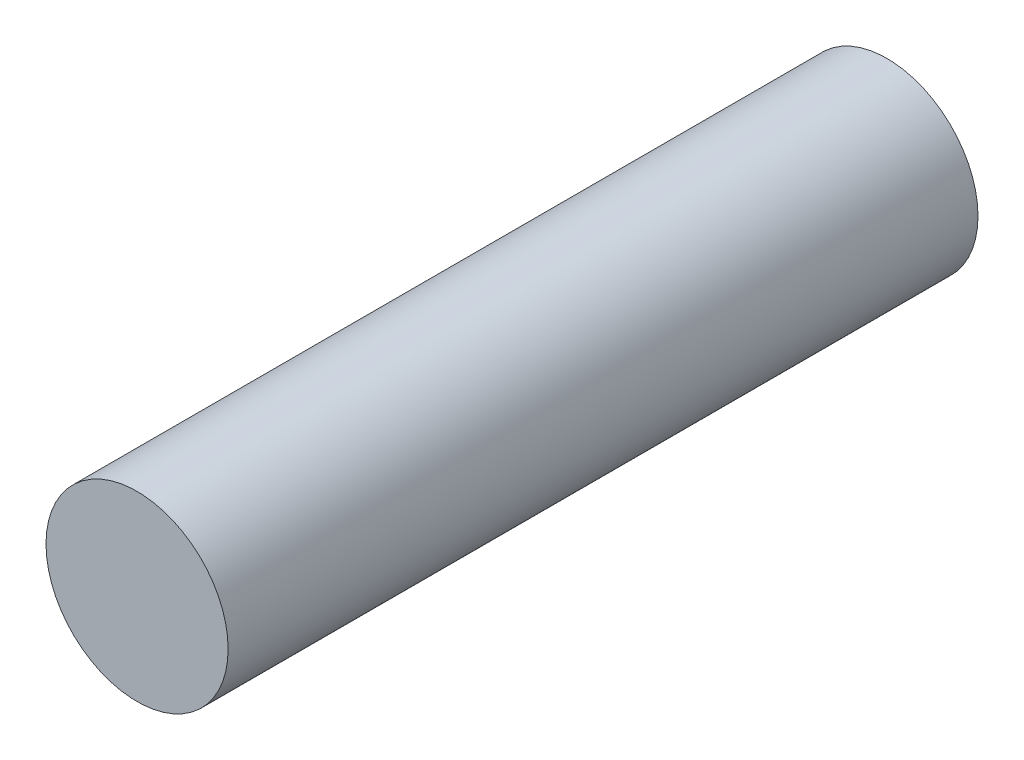
ISO-10303-21;
HEADER;
FILE_DESCRIPTION(('STEP AP214'),'2;1');
FILE_NAME('part.step','',(''),(''),'','','');
FILE_SCHEMA(('AUTOMOTIVE_DESIGN { 1 0 10303 214 1 1 1 1 }'));
ENDSEC;
DATA;
#1=APPLICATION_CONTEXT('core data for automotive mechanical design processes');
#2=APPLICATION_PROTOCOL_DEFINITION('international standard','automotive_design',2000,#1);
#3=PRODUCT_CONTEXT('',#1,'mechanical');
#4=PRODUCT('Part','Part','',(#3));
#5=PRODUCT_RELATED_PRODUCT_CATEGORY('part','',(#4));
#6=PRODUCT_DEFINITION_FORMATION('','',#4);
#7=PRODUCT_DEFINITION_CONTEXT('part definition',#1,'design');
#8=PRODUCT_DEFINITION('design','',#6,#7);
#9=PRODUCT_DEFINITION_SHAPE('','',#8);
#10=(LENGTH_UNIT() NAMED_UNIT(*) SI_UNIT(.MILLI.,.METRE.));
#11=(NAMED_UNIT(*) PLANE_ANGLE_UNIT() SI_UNIT($,.RADIAN.));
#12=(NAMED_UNIT(*) SI_UNIT($,.STERADIAN.) SOLID_ANGLE_UNIT());
#13=UNCERTAINTY_MEASURE_WITH_UNIT(LENGTH_MEASURE(1.E-05),#10,'distance_accuracy_value','');
#14=(GEOMETRIC_REPRESENTATION_CONTEXT(3) GLOBAL_UNCERTAINTY_ASSIGNED_CONTEXT((#13)) GLOBAL_UNIT_ASSIGNED_CONTEXT((#10,
#11,#12)) REPRESENTATION_CONTEXT('',''));
#15=CARTESIAN_POINT('',(0.,0.,0.));
#16=DIRECTION('',(0.,0.,1.));
#17=DIRECTION('',(1.,0.,0.));
#18=AXIS2_PLACEMENT_3D('',#15,#16,#17);
#19=CARTESIAN_POINT('',(0.,0.,35.));
#20=DIRECTION('',(0.,0.,-1.));
#21=DIRECTION('',(-1.,0.,0.));
#22=AXIS2_PLACEMENT_3D('',#19,#20,#21);
#23=CYLINDRICAL_SURFACE('',#22,4.25);
#24=CARTESIAN_POINT('',(0.,0.,35.));
#25=DIRECTION('',(0.,0.,1.));
#26=DIRECTION('',(1.,0.,0.));
#27=AXIS2_PLACEMENT_3D('',#24,#25,#26);
#28=CIRCLE('',#27,4.25);
#29=CARTESIAN_POINT('',(4.25,0.,35.));
#30=VERTEX_POINT('',#29);
#31=EDGE_CURVE('E10',#30,#30,#28,.T.);
#32=ORIENTED_EDGE('',*,*,#31,.F.);
#33=EDGE_LOOP('',(#32));
#34=FACE_BOUND('',#33,.T.);
#35=CARTESIAN_POINT('',(0.,0.,0.));
#36=DIRECTION('',(0.,0.,1.));
#37=DIRECTION('',(1.,0.,0.));
#38=AXIS2_PLACEMENT_3D('',#35,#36,#37);
#39=CIRCLE('',#38,4.25);
#40=CARTESIAN_POINT('',(4.25,0.,0.));
#41=VERTEX_POINT('',#40);
#42=EDGE_CURVE('E45',#41,#41,#39,.T.);
#43=ORIENTED_EDGE('',*,*,#42,.T.);
#44=EDGE_LOOP('',(#43));
#45=FACE_BOUND('',#44,.T.);
#46=ADVANCED_FACE('F42',(#34,#45),#23,.T.);
#47=CARTESIAN_POINT('',(0.,0.,35.));
#48=DIRECTION('',(0.,0.,1.));
#49=DIRECTION('',(1.,0.,0.));
#50=AXIS2_PLACEMENT_3D('',#47,#48,#49);
#51=PLANE('',#50);
#52=ORIENTED_EDGE('',*,*,#31,.T.);
#53=EDGE_LOOP('',(#52));
#54=FACE_BOUND('',#53,.T.);
#55=ADVANCED_FACE('F59',(#54),#51,.T.);
#56=CARTESIAN_POINT('',(0.,0.,0.));
#57=DIRECTION('',(0.,0.,1.));
#58=DIRECTION('',(1.,0.,0.));
#59=AXIS2_PLACEMENT_3D('',#56,#57,#58);
#60=PLANE('',#59);
#61=ORIENTED_EDGE('',*,*,#42,.F.);
#62=EDGE_LOOP('',(#61));
#63=FACE_BOUND('',#62,.T.);
#64=ADVANCED_FACE('F57',(#63),#60,.F.);
#65=CLOSED_SHELL('',(#46,#55,#64));
#66=MANIFOLD_SOLID_BREP('B2',#65);
#67=ADVANCED_BREP_SHAPE_REPRESENTATION('',(#18,#66),#14);
#68=SHAPE_DEFINITION_REPRESENTATION(#9,#67);
ENDSEC;
END-ISO-10303-21;
